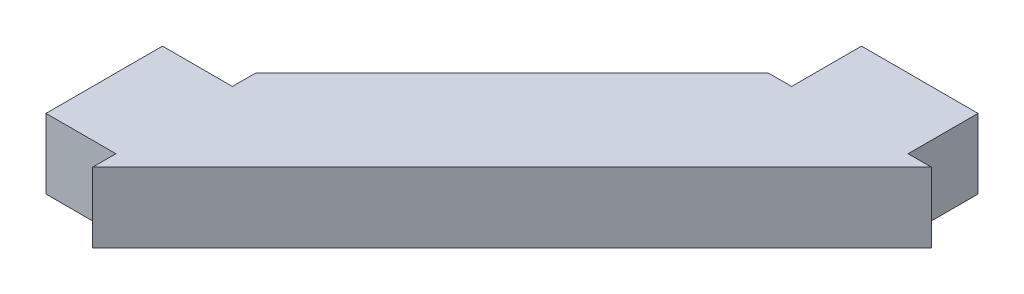
ISO-10303-21;
HEADER;
FILE_DESCRIPTION(('STEP AP214'),'2;1');
FILE_NAME('part.step','',(''),(''),'','','');
FILE_SCHEMA(('AUTOMOTIVE_DESIGN { 1 0 10303 214 1 1 1 1 }'));
ENDSEC;
DATA;
#1=APPLICATION_CONTEXT('core data for automotive mechanical design processes');
#2=APPLICATION_PROTOCOL_DEFINITION('international standard','automotive_design',2000,#1);
#3=PRODUCT_CONTEXT('',#1,'mechanical');
#4=PRODUCT('Part','Part','',(#3));
#5=PRODUCT_RELATED_PRODUCT_CATEGORY('part','',(#4));
#6=PRODUCT_DEFINITION_FORMATION('','',#4);
#7=PRODUCT_DEFINITION_CONTEXT('part definition',#1,'design');
#8=PRODUCT_DEFINITION('design','',#6,#7);
#9=PRODUCT_DEFINITION_SHAPE('','',#8);
#10=(LENGTH_UNIT() NAMED_UNIT(*) SI_UNIT(.MILLI.,.METRE.));
#11=(NAMED_UNIT(*) PLANE_ANGLE_UNIT() SI_UNIT($,.RADIAN.));
#12=(NAMED_UNIT(*) SI_UNIT($,.STERADIAN.) SOLID_ANGLE_UNIT());
#13=UNCERTAINTY_MEASURE_WITH_UNIT(LENGTH_MEASURE(1.E-05),#10,'distance_accuracy_value','');
#14=(GEOMETRIC_REPRESENTATION_CONTEXT(3) GLOBAL_UNCERTAINTY_ASSIGNED_CONTEXT((#13)) GLOBAL_UNIT_ASSIGNED_CONTEXT((#10,
#11,#12)) REPRESENTATION_CONTEXT('',''));
#15=CARTESIAN_POINT('',(0.,0.,0.));
#16=DIRECTION('',(0.,0.,1.));
#17=DIRECTION('',(1.,0.,0.));
#18=AXIS2_PLACEMENT_3D('',#15,#16,#17);
#19=CARTESIAN_POINT('',(0.,6.,37.0000000000072));
#20=DIRECTION('',(0.,0.,-1.));
#21=DIRECTION('',(-1.,0.,0.));
#22=AXIS2_PLACEMENT_3D('',#19,#20,#21);
#23=PLANE('',#22);
#24=DIRECTION('',(1.,0.,0.));
#25=VECTOR('',#24,1.);
#26=CARTESIAN_POINT('',(0.,0.,37.0000000000072));
#27=LINE('',#26,#25);
#28=CARTESIAN_POINT('',(-81.6734981961222,0.,37.0000000000072));
#29=VERTEX_POINT('',#28);
#30=CARTESIAN_POINT('',(-75.6734981961229,0.,37.0000000000072));
#31=VERTEX_POINT('',#30);
#32=EDGE_CURVE('E170',#29,#31,#27,.T.);
#33=ORIENTED_EDGE('',*,*,#32,.T.);
#34=DIRECTION('',(0.,-1.,0.));
#35=VECTOR('',#34,1.);
#36=CARTESIAN_POINT('',(-75.6734981961229,6.,37.0000000000072));
#37=LINE('',#36,#35);
#38=CARTESIAN_POINT('',(-75.6734981961229,6.,37.0000000000072));
#39=VERTEX_POINT('',#38);
#40=EDGE_CURVE('E12',#39,#31,#37,.T.);
#41=ORIENTED_EDGE('',*,*,#40,.F.);
#42=DIRECTION('',(1.,0.,0.));
#43=VECTOR('',#42,1.);
#44=CARTESIAN_POINT('',(0.,6.,37.0000000000072));
#45=LINE('',#44,#43);
#46=CARTESIAN_POINT('',(-81.6734981961222,6.,37.0000000000072));
#47=VERTEX_POINT('',#46);
#48=EDGE_CURVE('E194',#47,#39,#45,.T.);
#49=ORIENTED_EDGE('',*,*,#48,.F.);
#50=DIRECTION('',(0.,-1.,0.));
#51=VECTOR('',#50,1.);
#52=CARTESIAN_POINT('',(-81.6734981961222,6.,37.0000000000072));
#53=LINE('',#52,#51);
#54=EDGE_CURVE('E165',#47,#29,#53,.T.);
#55=ORIENTED_EDGE('',*,*,#54,.T.);
#56=EDGE_LOOP('',(#33,#41,#49,#55));
#57=FACE_BOUND('',#56,.T.);
#58=ADVANCED_FACE('F50',(#57),#23,.F.);
#59=CARTESIAN_POINT('',(-75.6734981961245,6.,0.));
#60=DIRECTION('',(1.,0.,0.));
#61=DIRECTION('',(0.,0.,-1.));
#62=AXIS2_PLACEMENT_3D('',#59,#60,#61);
#63=PLANE('',#62);
#64=DIRECTION('',(0.,0.,1.));
#65=VECTOR('',#64,1.);
#66=CARTESIAN_POINT('',(-75.6734981961245,0.,0.));
#67=LINE('',#66,#65);
#68=CARTESIAN_POINT('',(-75.6734981961245,0.,39.0000000000072));
#69=VERTEX_POINT('',#68);
#70=EDGE_CURVE('E173',#31,#69,#67,.T.);
#71=ORIENTED_EDGE('',*,*,#70,.T.);
#72=DIRECTION('',(0.,-1.,0.));
#73=VECTOR('',#72,1.);
#74=CARTESIAN_POINT('',(-75.6734981961245,6.,39.0000000000072));
#75=LINE('',#74,#73);
#76=CARTESIAN_POINT('',(-75.6734981961245,6.,39.0000000000072));
#77=VERTEX_POINT('',#76);
#78=EDGE_CURVE('E58',#77,#69,#75,.T.);
#79=ORIENTED_EDGE('',*,*,#78,.F.);
#80=DIRECTION('',(0.,0.,1.));
#81=VECTOR('',#80,1.);
#82=CARTESIAN_POINT('',(-75.6734981961245,6.,0.));
#83=LINE('',#82,#81);
#84=EDGE_CURVE('E117',#39,#77,#83,.T.);
#85=ORIENTED_EDGE('',*,*,#84,.F.);
#86=ORIENTED_EDGE('',*,*,#40,.T.);
#87=EDGE_LOOP('',(#71,#79,#85,#86));
#88=FACE_BOUND('',#87,.T.);
#89=ADVANCED_FACE('F268',(#88),#63,.F.);
#90=CARTESIAN_POINT('',(-18.3367490980723,6.,-18.3367490980656));
#91=DIRECTION('',(-0.707106781186675,0.,-0.70710678118642));
#92=DIRECTION('',(-0.70710678118642,0.,0.707106781186675));
#93=AXIS2_PLACEMENT_3D('',#90,#91,#92);
#94=PLANE('',#93);
#95=DIRECTION('',(0.70710678118642,0.,-0.707106781186675));
#96=VECTOR('',#95,1.);
#97=CARTESIAN_POINT('',(-18.3367490980723,0.,-18.3367490980656));
#98=LINE('',#97,#96);
#99=CARTESIAN_POINT('',(-39.6734981961302,0.,3.));
#100=VERTEX_POINT('',#99);
#101=EDGE_CURVE('E175',#69,#100,#98,.T.);
#102=ORIENTED_EDGE('',*,*,#101,.T.);
#103=DIRECTION('',(0.,-1.,0.));
#104=VECTOR('',#103,1.);
#105=CARTESIAN_POINT('',(-39.6734981961302,6.,3.));
#106=LINE('',#105,#104);
#107=CARTESIAN_POINT('',(-39.6734981961302,6.,3.));
#108=VERTEX_POINT('',#107);
#109=EDGE_CURVE('E210',#108,#100,#106,.T.);
#110=ORIENTED_EDGE('',*,*,#109,.F.);
#111=DIRECTION('',(0.70710678118642,0.,-0.707106781186675));
#112=VECTOR('',#111,1.);
#113=CARTESIAN_POINT('',(-18.3367490980723,6.,-18.3367490980656));
#114=LINE('',#113,#112);
#115=EDGE_CURVE('E218',#77,#108,#114,.T.);
#116=ORIENTED_EDGE('',*,*,#115,.F.);
#117=ORIENTED_EDGE('',*,*,#78,.T.);
#118=EDGE_LOOP('',(#102,#110,#116,#117));
#119=FACE_BOUND('',#118,.T.);
#120=ADVANCED_FACE('F216',(#119),#94,.F.);
#121=CARTESIAN_POINT('',(0.,6.,3.));
#122=DIRECTION('',(0.,0.,1.));
#123=DIRECTION('',(1.,0.,0.));
#124=AXIS2_PLACEMENT_3D('',#121,#122,#123);
#125=PLANE('',#124);
#126=DIRECTION('',(-1.,0.,0.));
#127=VECTOR('',#126,1.);
#128=CARTESIAN_POINT('',(0.,0.,3.));
#129=LINE('',#128,#127);
#130=CARTESIAN_POINT('',(-41.6734981961248,0.,3.));
#131=VERTEX_POINT('',#130);
#132=EDGE_CURVE('E177',#100,#131,#129,.T.);
#133=ORIENTED_EDGE('',*,*,#132,.T.);
#134=DIRECTION('',(0.,-1.,0.));
#135=VECTOR('',#134,1.);
#136=CARTESIAN_POINT('',(-41.6734981961248,6.,3.));
#137=LINE('',#136,#135);
#138=CARTESIAN_POINT('',(-41.6734981961248,6.,3.));
#139=VERTEX_POINT('',#138);
#140=EDGE_CURVE('E207',#139,#131,#137,.T.);
#141=ORIENTED_EDGE('',*,*,#140,.F.);
#142=DIRECTION('',(-1.,0.,0.));
#143=VECTOR('',#142,1.);
#144=CARTESIAN_POINT('',(0.,6.,3.));
#145=LINE('',#144,#143);
#146=EDGE_CURVE('E236',#108,#139,#145,.T.);
#147=ORIENTED_EDGE('',*,*,#146,.F.);
#148=ORIENTED_EDGE('',*,*,#109,.T.);
#149=EDGE_LOOP('',(#133,#141,#147,#148));
#150=FACE_BOUND('',#149,.T.);
#151=ADVANCED_FACE('F226',(#150),#125,.F.);
#152=CARTESIAN_POINT('',(-41.6734981961248,6.,0.));
#153=DIRECTION('',(-1.,0.,0.));
#154=DIRECTION('',(0.,0.,1.));
#155=AXIS2_PLACEMENT_3D('',#152,#153,#154);
#156=PLANE('',#155);
#157=DIRECTION('',(0.,0.,-1.));
#158=VECTOR('',#157,1.);
#159=CARTESIAN_POINT('',(-41.6734981961248,0.,0.));
#160=LINE('',#159,#158);
#161=CARTESIAN_POINT('',(-41.6734981961248,0.,-3.));
#162=VERTEX_POINT('',#161);
#163=EDGE_CURVE('E179',#131,#162,#160,.T.);
#164=ORIENTED_EDGE('',*,*,#163,.T.);
#165=DIRECTION('',(0.,-1.,0.));
#166=VECTOR('',#165,1.);
#167=CARTESIAN_POINT('',(-41.6734981961248,6.,-3.));
#168=LINE('',#167,#166);
#169=CARTESIAN_POINT('',(-41.6734981961248,6.,-3.));
#170=VERTEX_POINT('',#169);
#171=EDGE_CURVE('E205',#170,#162,#168,.T.);
#172=ORIENTED_EDGE('',*,*,#171,.F.);
#173=DIRECTION('',(0.,0.,-1.));
#174=VECTOR('',#173,1.);
#175=CARTESIAN_POINT('',(-41.6734981961248,6.,0.));
#176=LINE('',#175,#174);
#177=EDGE_CURVE('E232',#139,#170,#176,.T.);
#178=ORIENTED_EDGE('',*,*,#177,.F.);
#179=ORIENTED_EDGE('',*,*,#140,.T.);
#180=EDGE_LOOP('',(#164,#172,#178,#179));
#181=FACE_BOUND('',#180,.T.);
#182=ADVANCED_FACE('F230',(#181),#156,.F.);
#183=CARTESIAN_POINT('',(0.,6.,-3.));
#184=DIRECTION('',(0.,0.,-1.));
#185=DIRECTION('',(-1.,0.,0.));
#186=AXIS2_PLACEMENT_3D('',#183,#184,#185);
#187=PLANE('',#186);
#188=DIRECTION('',(1.,0.,0.));
#189=VECTOR('',#188,1.);
#190=CARTESIAN_POINT('',(0.,0.,-3.));
#191=LINE('',#190,#189);
#192=CARTESIAN_POINT('',(-51.6734981961248,0.,-3.));
#193=VERTEX_POINT('',#192);
#194=EDGE_CURVE('E183',#193,#162,#191,.T.);
#195=ORIENTED_EDGE('',*,*,#194,.F.);
#196=DIRECTION('',(0.,-1.,0.));
#197=VECTOR('',#196,1.);
#198=CARTESIAN_POINT('',(-51.6734981961248,6.,-3.));
#199=LINE('',#198,#197);
#200=CARTESIAN_POINT('',(-51.6734981961248,6.,-3.));
#201=VERTEX_POINT('',#200);
#202=EDGE_CURVE('E203',#201,#193,#199,.T.);
#203=ORIENTED_EDGE('',*,*,#202,.F.);
#204=DIRECTION('',(1.,0.,0.));
#205=VECTOR('',#204,1.);
#206=CARTESIAN_POINT('',(0.,6.,-3.));
#207=LINE('',#206,#205);
#208=EDGE_CURVE('E235',#201,#170,#207,.T.);
#209=ORIENTED_EDGE('',*,*,#208,.T.);
#210=ORIENTED_EDGE('',*,*,#171,.T.);
#211=EDGE_LOOP('',(#195,#203,#209,#210));
#212=FACE_BOUND('',#211,.T.);
#213=ADVANCED_FACE('F289',(#212),#187,.T.);
#214=CARTESIAN_POINT('',(-51.6734981961248,6.,0.));
#215=DIRECTION('',(-1.,0.,0.));
#216=DIRECTION('',(0.,0.,1.));
#217=AXIS2_PLACEMENT_3D('',#214,#215,#216);
#218=PLANE('',#217);
#219=DIRECTION('',(0.,0.,-1.));
#220=VECTOR('',#219,1.);
#221=CARTESIAN_POINT('',(-51.6734981961248,0.,0.));
#222=LINE('',#221,#220);
#223=CARTESIAN_POINT('',(-51.6734981961248,0.,3.));
#224=VERTEX_POINT('',#223);
#225=EDGE_CURVE('E186',#224,#193,#222,.T.);
#226=ORIENTED_EDGE('',*,*,#225,.F.);
#227=DIRECTION('',(0.,-1.,0.));
#228=VECTOR('',#227,1.);
#229=CARTESIAN_POINT('',(-51.6734981961248,6.,3.));
#230=LINE('',#229,#228);
#231=CARTESIAN_POINT('',(-51.6734981961248,6.,3.));
#232=VERTEX_POINT('',#231);
#233=EDGE_CURVE('E201',#232,#224,#230,.T.);
#234=ORIENTED_EDGE('',*,*,#233,.F.);
#235=DIRECTION('',(0.,0.,-1.));
#236=VECTOR('',#235,1.);
#237=CARTESIAN_POINT('',(-51.6734981961248,6.,0.));
#238=LINE('',#237,#236);
#239=EDGE_CURVE('E238',#232,#201,#238,.T.);
#240=ORIENTED_EDGE('',*,*,#239,.T.);
#241=ORIENTED_EDGE('',*,*,#202,.T.);
#242=EDGE_LOOP('',(#226,#234,#240,#241));
#243=FACE_BOUND('',#242,.T.);
#244=ADVANCED_FACE('F284',(#243),#218,.T.);
#245=CARTESIAN_POINT('',(-53.6734981961248,0.,3.));
#246=VERTEX_POINT('',#245);
#247=EDGE_CURVE('E180',#224,#246,#129,.T.);
#248=ORIENTED_EDGE('',*,*,#247,.T.);
#249=DIRECTION('',(0.,-1.,0.));
#250=VECTOR('',#249,1.);
#251=CARTESIAN_POINT('',(-53.6734981961248,6.,3.));
#252=LINE('',#251,#250);
#253=CARTESIAN_POINT('',(-53.6734981961248,6.,3.));
#254=VERTEX_POINT('',#253);
#255=EDGE_CURVE('E198',#254,#246,#252,.T.);
#256=ORIENTED_EDGE('',*,*,#255,.F.);
#257=EDGE_CURVE('E241',#232,#254,#145,.T.);
#258=ORIENTED_EDGE('',*,*,#257,.F.);
#259=ORIENTED_EDGE('',*,*,#233,.T.);
#260=EDGE_LOOP('',(#248,#256,#258,#259));
#261=FACE_BOUND('',#260,.T.);
#262=ADVANCED_FACE('F249',(#261),#125,.F.);
#263=CARTESIAN_POINT('',(-25.336749098072,6.,-25.3367490980629));
#264=DIRECTION('',(0.707106781186675,0.,0.70710678118642));
#265=DIRECTION('',(0.70710678118642,0.,-0.707106781186675));
#266=AXIS2_PLACEMENT_3D('',#263,#264,#265);
#267=PLANE('',#266);
#268=DIRECTION('',(-0.70710678118642,0.,0.707106781186675));
#269=VECTOR('',#268,1.);
#270=CARTESIAN_POINT('',(-25.336749098072,0.,-25.3367490980629));
#271=LINE('',#270,#269);
#272=CARTESIAN_POINT('',(-75.6734981961245,0.,25.0000000000076));
#273=VERTEX_POINT('',#272);
#274=EDGE_CURVE('E189',#246,#273,#271,.T.);
#275=ORIENTED_EDGE('',*,*,#274,.T.);
#276=DIRECTION('',(0.,-1.,0.));
#277=VECTOR('',#276,1.);
#278=CARTESIAN_POINT('',(-75.6734981961245,6.,25.0000000000076));
#279=LINE('',#278,#277);
#280=CARTESIAN_POINT('',(-75.6734981961245,6.,25.0000000000076));
#281=VERTEX_POINT('',#280);
#282=EDGE_CURVE('E161',#281,#273,#279,.T.);
#283=ORIENTED_EDGE('',*,*,#282,.F.);
#284=DIRECTION('',(-0.70710678118642,0.,0.707106781186675));
#285=VECTOR('',#284,1.);
#286=CARTESIAN_POINT('',(-25.336749098072,6.,-25.3367490980629));
#287=LINE('',#286,#285);
#288=EDGE_CURVE('E148',#254,#281,#287,.T.);
#289=ORIENTED_EDGE('',*,*,#288,.F.);
#290=ORIENTED_EDGE('',*,*,#255,.T.);
#291=EDGE_LOOP('',(#275,#283,#289,#290));
#292=FACE_BOUND('',#291,.T.);
#293=ADVANCED_FACE('F253',(#292),#267,.F.);
#294=CARTESIAN_POINT('',(-75.6734981961229,0.,27.0000000000076));
#295=VERTEX_POINT('',#294);
#296=EDGE_CURVE('E157',#273,#295,#67,.T.);
#297=ORIENTED_EDGE('',*,*,#296,.T.);
#298=DIRECTION('',(0.,-1.,0.));
#299=VECTOR('',#298,1.);
#300=CARTESIAN_POINT('',(-75.6734981961229,6.,27.0000000000076));
#301=LINE('',#300,#299);
#302=CARTESIAN_POINT('',(-75.6734981961229,6.,27.0000000000076));
#303=VERTEX_POINT('',#302);
#304=EDGE_CURVE('E154',#303,#295,#301,.T.);
#305=ORIENTED_EDGE('',*,*,#304,.F.);
#306=EDGE_CURVE('E142',#281,#303,#83,.T.);
#307=ORIENTED_EDGE('',*,*,#306,.F.);
#308=ORIENTED_EDGE('',*,*,#282,.T.);
#309=EDGE_LOOP('',(#297,#305,#307,#308));
#310=FACE_BOUND('',#309,.T.);
#311=ADVANCED_FACE('F155',(#310),#63,.F.);
#312=CARTESIAN_POINT('',(0.,6.,27.0000000000076));
#313=DIRECTION('',(0.,0.,-1.));
#314=DIRECTION('',(-1.,0.,0.));
#315=AXIS2_PLACEMENT_3D('',#312,#313,#314);
#316=PLANE('',#315);
#317=DIRECTION('',(1.,0.,0.));
#318=VECTOR('',#317,1.);
#319=CARTESIAN_POINT('',(0.,0.,27.0000000000076));
#320=LINE('',#319,#318);
#321=CARTESIAN_POINT('',(-81.6734981961222,0.,27.0000000000076));
#322=VERTEX_POINT('',#321);
#323=EDGE_CURVE('E191',#322,#295,#320,.T.);
#324=ORIENTED_EDGE('',*,*,#323,.F.);
#325=DIRECTION('',(0.,-1.,0.));
#326=VECTOR('',#325,1.);
#327=CARTESIAN_POINT('',(-81.6734981961222,6.,27.0000000000076));
#328=LINE('',#327,#326);
#329=CARTESIAN_POINT('',(-81.6734981961222,6.,27.0000000000076));
#330=VERTEX_POINT('',#329);
#331=EDGE_CURVE('E106',#330,#322,#328,.T.);
#332=ORIENTED_EDGE('',*,*,#331,.F.);
#333=DIRECTION('',(1.,0.,0.));
#334=VECTOR('',#333,1.);
#335=CARTESIAN_POINT('',(0.,6.,27.0000000000076));
#336=LINE('',#335,#334);
#337=EDGE_CURVE('E146',#330,#303,#336,.T.);
#338=ORIENTED_EDGE('',*,*,#337,.T.);
#339=ORIENTED_EDGE('',*,*,#304,.T.);
#340=EDGE_LOOP('',(#324,#332,#338,#339));
#341=FACE_BOUND('',#340,.T.);
#342=ADVANCED_FACE('F163',(#341),#316,.T.);
#343=CARTESIAN_POINT('',(-81.6734981961222,6.,0.));
#344=DIRECTION('',(1.,0.,0.));
#345=DIRECTION('',(0.,0.,-1.));
#346=AXIS2_PLACEMENT_3D('',#343,#344,#345);
#347=PLANE('',#346);
#348=DIRECTION('',(0.,0.,1.));
#349=VECTOR('',#348,1.);
#350=CARTESIAN_POINT('',(-81.6734981961222,0.,0.));
#351=LINE('',#350,#349);
#352=EDGE_CURVE('E109',#322,#29,#351,.T.);
#353=ORIENTED_EDGE('',*,*,#352,.T.);
#354=ORIENTED_EDGE('',*,*,#54,.F.);
#355=DIRECTION('',(0.,0.,1.));
#356=VECTOR('',#355,1.);
#357=CARTESIAN_POINT('',(-81.6734981961222,6.,0.));
#358=LINE('',#357,#356);
#359=EDGE_CURVE('E66',#330,#47,#358,.T.);
#360=ORIENTED_EDGE('',*,*,#359,.F.);
#361=ORIENTED_EDGE('',*,*,#331,.T.);
#362=EDGE_LOOP('',(#353,#354,#360,#361));
#363=FACE_BOUND('',#362,.T.);
#364=ADVANCED_FACE('F257',(#363),#347,.F.);
#365=CARTESIAN_POINT('',(0.,6.,0.));
#366=DIRECTION('',(0.,1.,0.));
#367=DIRECTION('',(0.,0.,1.));
#368=AXIS2_PLACEMENT_3D('',#365,#366,#367);
#369=PLANE('',#368);
#370=ORIENTED_EDGE('',*,*,#48,.T.);
#371=ORIENTED_EDGE('',*,*,#84,.T.);
#372=ORIENTED_EDGE('',*,*,#115,.T.);
#373=ORIENTED_EDGE('',*,*,#146,.T.);
#374=ORIENTED_EDGE('',*,*,#177,.T.);
#375=ORIENTED_EDGE('',*,*,#208,.F.);
#376=ORIENTED_EDGE('',*,*,#239,.F.);
#377=ORIENTED_EDGE('',*,*,#257,.T.);
#378=ORIENTED_EDGE('',*,*,#288,.T.);
#379=ORIENTED_EDGE('',*,*,#306,.T.);
#380=ORIENTED_EDGE('',*,*,#337,.F.);
#381=ORIENTED_EDGE('',*,*,#359,.T.);
#382=EDGE_LOOP('',(#370,#371,#372,#373,#374,#375,#376,#377,#378,#379,#380,#381));
#383=FACE_BOUND('',#382,.T.);
#384=ADVANCED_FACE('F144',(#383),#369,.T.);
#385=CARTESIAN_POINT('',(0.,0.,0.));
#386=DIRECTION('',(0.,1.,0.));
#387=DIRECTION('',(0.,0.,1.));
#388=AXIS2_PLACEMENT_3D('',#385,#386,#387);
#389=PLANE('',#388);
#390=ORIENTED_EDGE('',*,*,#32,.F.);
#391=ORIENTED_EDGE('',*,*,#352,.F.);
#392=ORIENTED_EDGE('',*,*,#323,.T.);
#393=ORIENTED_EDGE('',*,*,#296,.F.);
#394=ORIENTED_EDGE('',*,*,#274,.F.);
#395=ORIENTED_EDGE('',*,*,#247,.F.);
#396=ORIENTED_EDGE('',*,*,#225,.T.);
#397=ORIENTED_EDGE('',*,*,#194,.T.);
#398=ORIENTED_EDGE('',*,*,#163,.F.);
#399=ORIENTED_EDGE('',*,*,#132,.F.);
#400=ORIENTED_EDGE('',*,*,#101,.F.);
#401=ORIENTED_EDGE('',*,*,#70,.F.);
#402=EDGE_LOOP('',(#390,#391,#392,#393,#394,#395,#396,#397,#398,#399,#400,#401));
#403=FACE_BOUND('',#402,.T.);
#404=ADVANCED_FACE('F222',(#403),#389,.F.);
#405=CLOSED_SHELL('',(#58,#89,#120,#151,#182,#213,#244,#262,#293,#311,#342,#364,#384,#404));
#406=MANIFOLD_SOLID_BREP('B2',#405);
#407=ADVANCED_BREP_SHAPE_REPRESENTATION('',(#18,#406),#14);
#408=SHAPE_DEFINITION_REPRESENTATION(#9,#407);
ENDSEC;
END-ISO-10303-21;
